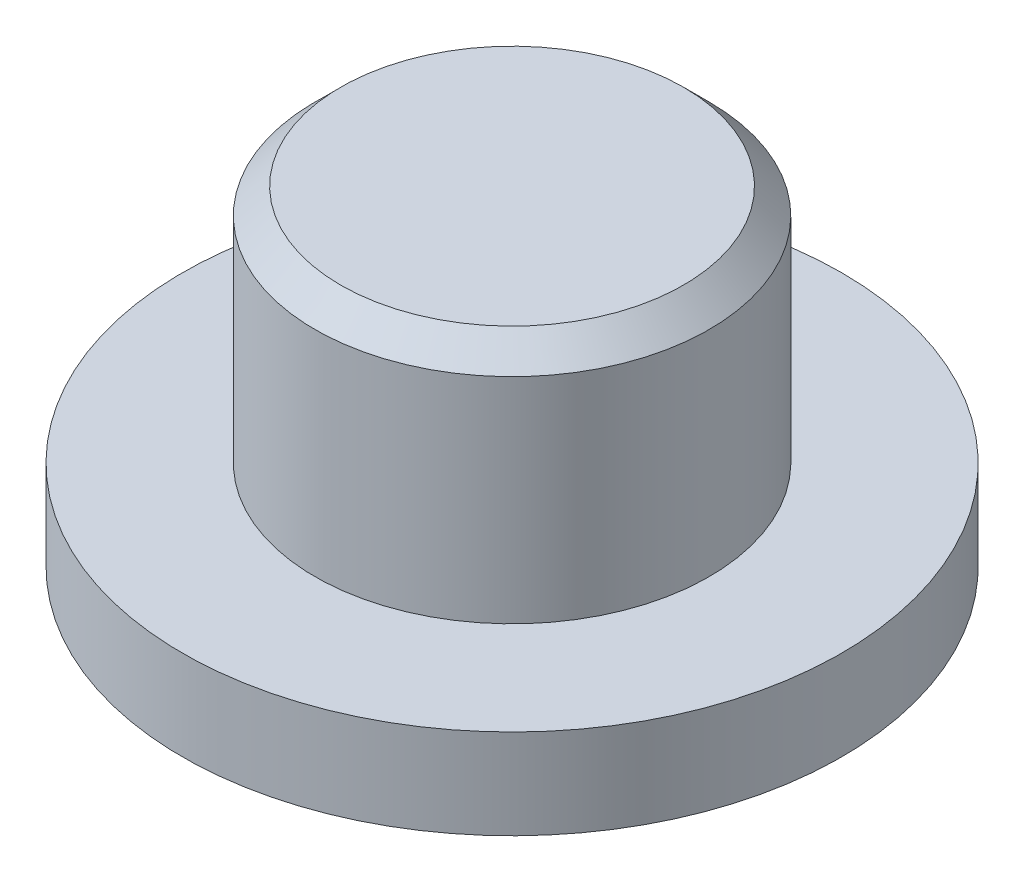
ISO-10303-21;
HEADER;
FILE_DESCRIPTION(('STEP AP214'),'2;1');
FILE_NAME('part.step','',(''),(''),'','','');
FILE_SCHEMA(('AUTOMOTIVE_DESIGN { 1 0 10303 214 1 1 1 1 }'));
ENDSEC;
DATA;
#1=APPLICATION_CONTEXT('core data for automotive mechanical design processes');
#2=APPLICATION_PROTOCOL_DEFINITION('international standard','automotive_design',2000,#1);
#3=PRODUCT_CONTEXT('',#1,'mechanical');
#4=PRODUCT('Part','Part','',(#3));
#5=PRODUCT_RELATED_PRODUCT_CATEGORY('part','',(#4));
#6=PRODUCT_DEFINITION_FORMATION('','',#4);
#7=PRODUCT_DEFINITION_CONTEXT('part definition',#1,'design');
#8=PRODUCT_DEFINITION('design','',#6,#7);
#9=PRODUCT_DEFINITION_SHAPE('','',#8);
#10=(LENGTH_UNIT() NAMED_UNIT(*) SI_UNIT(.MILLI.,.METRE.));
#11=(NAMED_UNIT(*) PLANE_ANGLE_UNIT() SI_UNIT($,.RADIAN.));
#12=(NAMED_UNIT(*) SI_UNIT($,.STERADIAN.) SOLID_ANGLE_UNIT());
#13=UNCERTAINTY_MEASURE_WITH_UNIT(LENGTH_MEASURE(1.E-05),#10,'distance_accuracy_value','');
#14=(GEOMETRIC_REPRESENTATION_CONTEXT(3) GLOBAL_UNCERTAINTY_ASSIGNED_CONTEXT((#13)) GLOBAL_UNIT_ASSIGNED_CONTEXT((#10,
#11,#12)) REPRESENTATION_CONTEXT('',''));
#15=CARTESIAN_POINT('',(0.,0.,0.));
#16=DIRECTION('',(0.,0.,1.));
#17=DIRECTION('',(1.,0.,0.));
#18=AXIS2_PLACEMENT_3D('',#15,#16,#17);
#19=CARTESIAN_POINT('',(0.,-3.,0.));
#20=DIRECTION('',(0.,1.,0.));
#21=DIRECTION('',(0.,0.,1.));
#22=AXIS2_PLACEMENT_3D('',#19,#20,#21);
#23=PLANE('',#22);
#24=CARTESIAN_POINT('',(0.,-3.,0.));
#25=DIRECTION('',(0.,-1.,0.));
#26=DIRECTION('',(0.,0.,-1.));
#27=AXIS2_PLACEMENT_3D('',#24,#25,#26);
#28=CIRCLE('',#27,11.);
#29=CARTESIAN_POINT('',(0.,-3.,-11.));
#30=VERTEX_POINT('',#29);
#31=EDGE_CURVE('E10',#30,#30,#28,.T.);
#32=ORIENTED_EDGE('',*,*,#31,.T.);
#33=EDGE_LOOP('',(#32));
#34=FACE_BOUND('',#33,.T.);
#35=ADVANCED_FACE('F47',(#34),#23,.F.);
#36=CARTESIAN_POINT('',(0.,0.,0.));
#37=DIRECTION('',(0.,-1.,0.));
#38=DIRECTION('',(0.,0.,-1.));
#39=AXIS2_PLACEMENT_3D('',#36,#37,#38);
#40=CYLINDRICAL_SURFACE('',#39,11.);
#41=ORIENTED_EDGE('',*,*,#31,.F.);
#42=EDGE_LOOP('',(#41));
#43=FACE_BOUND('',#42,.T.);
#44=CARTESIAN_POINT('',(0.,0.,0.));
#45=DIRECTION('',(0.,-1.,0.));
#46=DIRECTION('',(0.,0.,-1.));
#47=AXIS2_PLACEMENT_3D('',#44,#45,#46);
#48=CIRCLE('',#47,11.);
#49=CARTESIAN_POINT('',(0.,0.,-11.));
#50=VERTEX_POINT('',#49);
#51=EDGE_CURVE('E54',#50,#50,#48,.T.);
#52=ORIENTED_EDGE('',*,*,#51,.T.);
#53=EDGE_LOOP('',(#52));
#54=FACE_BOUND('',#53,.T.);
#55=ADVANCED_FACE('F91',(#43,#54),#40,.T.);
#56=CARTESIAN_POINT('',(0.,0.,0.));
#57=DIRECTION('',(0.,-1.,0.));
#58=DIRECTION('',(0.,0.,-1.));
#59=AXIS2_PLACEMENT_3D('',#56,#57,#58);
#60=PLANE('',#59);
#61=ORIENTED_EDGE('',*,*,#51,.F.);
#62=EDGE_LOOP('',(#61));
#63=FACE_BOUND('',#62,.T.);
#64=CARTESIAN_POINT('',(0.,0.,0.));
#65=DIRECTION('',(0.,-1.,0.));
#66=DIRECTION('',(0.,0.,-1.));
#67=AXIS2_PLACEMENT_3D('',#64,#65,#66);
#68=CIRCLE('',#67,6.5785);
#69=CARTESIAN_POINT('',(0.,0.,-6.5785));
#70=VERTEX_POINT('',#69);
#71=EDGE_CURVE('E59',#70,#70,#68,.T.);
#72=ORIENTED_EDGE('',*,*,#71,.T.);
#73=EDGE_LOOP('',(#72));
#74=FACE_BOUND('',#73,.T.);
#75=ADVANCED_FACE('F95',(#63,#74),#60,.F.);
#76=CARTESIAN_POINT('',(0.,8.,0.));
#77=DIRECTION('',(0.,-1.,0.));
#78=DIRECTION('',(0.,0.,-1.));
#79=AXIS2_PLACEMENT_3D('',#76,#77,#78);
#80=CYLINDRICAL_SURFACE('',#79,6.5785);
#81=ORIENTED_EDGE('',*,*,#71,.F.);
#82=EDGE_LOOP('',(#81));
#83=FACE_BOUND('',#82,.T.);
#84=CARTESIAN_POINT('',(0.,7.144,0.));
#85=DIRECTION('',(0.,-1.,0.));
#86=DIRECTION('',(0.,0.,-1.));
#87=AXIS2_PLACEMENT_3D('',#84,#85,#86);
#88=CIRCLE('',#87,6.5785);
#89=CARTESIAN_POINT('',(0.,7.144,-6.5785));
#90=VERTEX_POINT('',#89);
#91=EDGE_CURVE('E70',#90,#90,#88,.T.);
#92=ORIENTED_EDGE('',*,*,#91,.T.);
#93=EDGE_LOOP('',(#92));
#94=FACE_BOUND('',#93,.T.);
#95=ADVANCED_FACE('F75',(#83,#94),#80,.T.);
#96=CARTESIAN_POINT('',(0.,8.,0.));
#97=DIRECTION('',(0.,-1.,0.));
#98=DIRECTION('',(0.,0.,-1.));
#99=AXIS2_PLACEMENT_3D('',#96,#97,#98);
#100=CONICAL_SURFACE('',#99,5.7225,0.785398163397449);
#101=ORIENTED_EDGE('',*,*,#91,.F.);
#102=EDGE_LOOP('',(#101));
#103=FACE_BOUND('',#102,.T.);
#104=CARTESIAN_POINT('',(0.,8.,0.));
#105=DIRECTION('',(0.,-1.,0.));
#106=DIRECTION('',(0.,0.,-1.));
#107=AXIS2_PLACEMENT_3D('',#104,#105,#106);
#108=CIRCLE('',#107,5.7225);
#109=CARTESIAN_POINT('',(0.,8.,-5.7225));
#110=VERTEX_POINT('',#109);
#111=EDGE_CURVE('E64',#110,#110,#108,.T.);
#112=ORIENTED_EDGE('',*,*,#111,.T.);
#113=EDGE_LOOP('',(#112));
#114=FACE_BOUND('',#113,.T.);
#115=ADVANCED_FACE('F77',(#103,#114),#100,.T.);
#116=CARTESIAN_POINT('',(0.,8.,0.));
#117=DIRECTION('',(0.,-1.,0.));
#118=DIRECTION('',(0.,0.,-1.));
#119=AXIS2_PLACEMENT_3D('',#116,#117,#118);
#120=PLANE('',#119);
#121=ORIENTED_EDGE('',*,*,#111,.F.);
#122=EDGE_LOOP('',(#121));
#123=FACE_BOUND('',#122,.T.);
#124=ADVANCED_FACE('F80',(#123),#120,.F.);
#125=CLOSED_SHELL('',(#35,#55,#75,#95,#115,#124));
#126=MANIFOLD_SOLID_BREP('B2',#125);
#127=ADVANCED_BREP_SHAPE_REPRESENTATION('',(#18,#126),#14);
#128=SHAPE_DEFINITION_REPRESENTATION(#9,#127);
ENDSEC;
END-ISO-10303-21;
